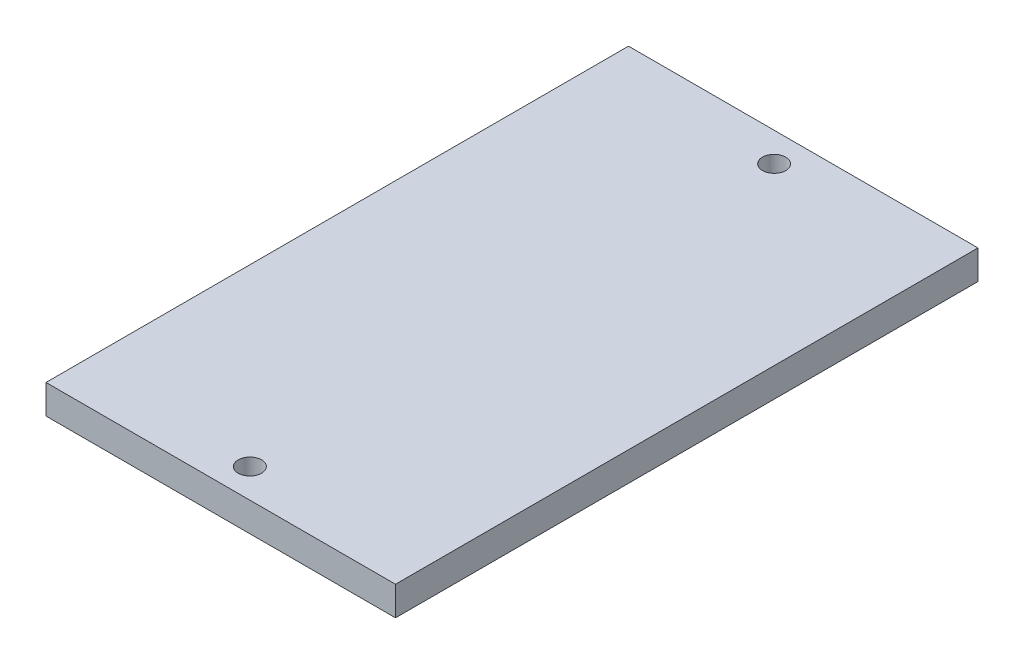
ISO-10303-21;
HEADER;
FILE_DESCRIPTION(('STEP AP214'),'2;1');
FILE_NAME('part.step','',(''),(''),'','','');
FILE_SCHEMA(('AUTOMOTIVE_DESIGN { 1 0 10303 214 1 1 1 1 }'));
ENDSEC;
DATA;
#1=APPLICATION_CONTEXT('core data for automotive mechanical design processes');
#2=APPLICATION_PROTOCOL_DEFINITION('international standard','automotive_design',2000,#1);
#3=PRODUCT_CONTEXT('',#1,'mechanical');
#4=PRODUCT('Part','Part','',(#3));
#5=PRODUCT_RELATED_PRODUCT_CATEGORY('part','',(#4));
#6=PRODUCT_DEFINITION_FORMATION('','',#4);
#7=PRODUCT_DEFINITION_CONTEXT('part definition',#1,'design');
#8=PRODUCT_DEFINITION('design','',#6,#7);
#9=PRODUCT_DEFINITION_SHAPE('','',#8);
#10=(LENGTH_UNIT() NAMED_UNIT(*) SI_UNIT(.MILLI.,.METRE.));
#11=(NAMED_UNIT(*) PLANE_ANGLE_UNIT() SI_UNIT($,.RADIAN.));
#12=(NAMED_UNIT(*) SI_UNIT($,.STERADIAN.) SOLID_ANGLE_UNIT());
#13=UNCERTAINTY_MEASURE_WITH_UNIT(LENGTH_MEASURE(1.E-05),#10,'distance_accuracy_value','');
#14=(GEOMETRIC_REPRESENTATION_CONTEXT(3) GLOBAL_UNCERTAINTY_ASSIGNED_CONTEXT((#13)) GLOBAL_UNIT_ASSIGNED_CONTEXT((#10,
#11,#12)) REPRESENTATION_CONTEXT('',''));
#15=CARTESIAN_POINT('',(0.,0.,0.));
#16=DIRECTION('',(0.,0.,1.));
#17=DIRECTION('',(1.,0.,0.));
#18=AXIS2_PLACEMENT_3D('',#15,#16,#17);
#19=CARTESIAN_POINT('',(36.2285196606894,6.35,63.5));
#20=DIRECTION('',(-1.,0.,0.));
#21=DIRECTION('',(0.,0.,1.));
#22=AXIS2_PLACEMENT_3D('',#19,#20,#21);
#23=PLANE('',#22);
#24=DIRECTION('',(0.,0.,-1.));
#25=VECTOR('',#24,1.);
#26=CARTESIAN_POINT('',(36.2285196606894,0.,63.5));
#27=LINE('',#26,#25);
#28=CARTESIAN_POINT('',(36.2285196606894,0.,63.5));
#29=VERTEX_POINT('',#28);
#30=CARTESIAN_POINT('',(36.2285196606894,0.,-63.5));
#31=VERTEX_POINT('',#30);
#32=EDGE_CURVE('E105',#29,#31,#27,.T.);
#33=ORIENTED_EDGE('',*,*,#32,.T.);
#34=DIRECTION('',(0.,-1.,0.));
#35=VECTOR('',#34,1.);
#36=CARTESIAN_POINT('',(36.2285196606894,6.35,-63.5));
#37=LINE('',#36,#35);
#38=CARTESIAN_POINT('',(36.2285196606894,6.35,-63.5));
#39=VERTEX_POINT('',#38);
#40=EDGE_CURVE('E11',#39,#31,#37,.T.);
#41=ORIENTED_EDGE('',*,*,#40,.F.);
#42=DIRECTION('',(0.,0.,-1.));
#43=VECTOR('',#42,1.);
#44=CARTESIAN_POINT('',(36.2285196606894,6.35,63.5));
#45=LINE('',#44,#43);
#46=CARTESIAN_POINT('',(36.2285196606894,6.35,63.5));
#47=VERTEX_POINT('',#46);
#48=EDGE_CURVE('E92',#47,#39,#45,.T.);
#49=ORIENTED_EDGE('',*,*,#48,.F.);
#50=DIRECTION('',(0.,-1.,0.));
#51=VECTOR('',#50,1.);
#52=CARTESIAN_POINT('',(36.2285196606894,6.35,63.5));
#53=LINE('',#52,#51);
#54=EDGE_CURVE('E101',#47,#29,#53,.T.);
#55=ORIENTED_EDGE('',*,*,#54,.T.);
#56=EDGE_LOOP('',(#33,#41,#49,#55));
#57=FACE_BOUND('',#56,.T.);
#58=ADVANCED_FACE('F39',(#57),#23,.F.);
#59=CARTESIAN_POINT('',(-39.9714803393106,6.35,-63.5));
#60=DIRECTION('',(0.,0.,1.));
#61=DIRECTION('',(1.,0.,0.));
#62=AXIS2_PLACEMENT_3D('',#59,#60,#61);
#63=PLANE('',#62);
#64=DIRECTION('',(-1.,0.,0.));
#65=VECTOR('',#64,1.);
#66=CARTESIAN_POINT('',(-39.9714803393106,0.,-63.5));
#67=LINE('',#66,#65);
#68=CARTESIAN_POINT('',(-39.9714803393106,0.,-63.5));
#69=VERTEX_POINT('',#68);
#70=EDGE_CURVE('E96',#31,#69,#67,.T.);
#71=ORIENTED_EDGE('',*,*,#70,.T.);
#72=DIRECTION('',(0.,-1.,0.));
#73=VECTOR('',#72,1.);
#74=CARTESIAN_POINT('',(-39.9714803393106,6.35,-63.5));
#75=LINE('',#74,#73);
#76=CARTESIAN_POINT('',(-39.9714803393106,6.35,-63.5));
#77=VERTEX_POINT('',#76);
#78=EDGE_CURVE('E48',#77,#69,#75,.T.);
#79=ORIENTED_EDGE('',*,*,#78,.F.);
#80=DIRECTION('',(-1.,0.,0.));
#81=VECTOR('',#80,1.);
#82=CARTESIAN_POINT('',(-39.9714803393106,6.35,-63.5));
#83=LINE('',#82,#81);
#84=EDGE_CURVE('E87',#39,#77,#83,.T.);
#85=ORIENTED_EDGE('',*,*,#84,.F.);
#86=ORIENTED_EDGE('',*,*,#40,.T.);
#87=EDGE_LOOP('',(#71,#79,#85,#86));
#88=FACE_BOUND('',#87,.T.);
#89=ADVANCED_FACE('F95',(#88),#63,.F.);
#90=CARTESIAN_POINT('',(-39.9714803393106,6.35,63.5));
#91=DIRECTION('',(1.,0.,0.));
#92=DIRECTION('',(0.,0.,-1.));
#93=AXIS2_PLACEMENT_3D('',#90,#91,#92);
#94=PLANE('',#93);
#95=DIRECTION('',(0.,0.,1.));
#96=VECTOR('',#95,1.);
#97=CARTESIAN_POINT('',(-39.9714803393106,0.,63.5));
#98=LINE('',#97,#96);
#99=CARTESIAN_POINT('',(-39.9714803393106,0.,63.5));
#100=VERTEX_POINT('',#99);
#101=EDGE_CURVE('E74',#69,#100,#98,.T.);
#102=ORIENTED_EDGE('',*,*,#101,.T.);
#103=DIRECTION('',(0.,-1.,0.));
#104=VECTOR('',#103,1.);
#105=CARTESIAN_POINT('',(-39.9714803393106,6.35,63.5));
#106=LINE('',#105,#104);
#107=CARTESIAN_POINT('',(-39.9714803393106,6.35,63.5));
#108=VERTEX_POINT('',#107);
#109=EDGE_CURVE('E97',#108,#100,#106,.T.);
#110=ORIENTED_EDGE('',*,*,#109,.F.);
#111=DIRECTION('',(0.,0.,1.));
#112=VECTOR('',#111,1.);
#113=CARTESIAN_POINT('',(-39.9714803393106,6.35,63.5));
#114=LINE('',#113,#112);
#115=EDGE_CURVE('E90',#77,#108,#114,.T.);
#116=ORIENTED_EDGE('',*,*,#115,.F.);
#117=ORIENTED_EDGE('',*,*,#78,.T.);
#118=EDGE_LOOP('',(#102,#110,#116,#117));
#119=FACE_BOUND('',#118,.T.);
#120=ADVANCED_FACE('F99',(#119),#94,.F.);
#121=CARTESIAN_POINT('',(-39.9714803393106,6.35,63.5));
#122=DIRECTION('',(0.,0.,-1.));
#123=DIRECTION('',(-1.,0.,0.));
#124=AXIS2_PLACEMENT_3D('',#121,#122,#123);
#125=PLANE('',#124);
#126=DIRECTION('',(1.,0.,0.));
#127=VECTOR('',#126,1.);
#128=CARTESIAN_POINT('',(-39.9714803393106,0.,63.5));
#129=LINE('',#128,#127);
#130=EDGE_CURVE('E80',#100,#29,#129,.T.);
#131=ORIENTED_EDGE('',*,*,#130,.T.);
#132=ORIENTED_EDGE('',*,*,#54,.F.);
#133=DIRECTION('',(1.,0.,0.));
#134=VECTOR('',#133,1.);
#135=CARTESIAN_POINT('',(-39.9714803393106,6.35,63.5));
#136=LINE('',#135,#134);
#137=EDGE_CURVE('E57',#108,#47,#136,.T.);
#138=ORIENTED_EDGE('',*,*,#137,.F.);
#139=ORIENTED_EDGE('',*,*,#109,.T.);
#140=EDGE_LOOP('',(#131,#132,#138,#139));
#141=FACE_BOUND('',#140,.T.);
#142=ADVANCED_FACE('F131',(#141),#125,.F.);
#143=CARTESIAN_POINT('',(0.,6.35,0.));
#144=DIRECTION('',(0.,-1.,0.));
#145=DIRECTION('',(0.,0.,-1.));
#146=AXIS2_PLACEMENT_3D('',#143,#144,#145);
#147=PLANE('',#146);
#148=CARTESIAN_POINT('',(-1.87148033931062,6.35,-57.15));
#149=DIRECTION('',(0.,1.,0.));
#150=DIRECTION('',(0.,0.,1.));
#151=AXIS2_PLACEMENT_3D('',#148,#149,#150);
#152=CIRCLE('',#151,2.53999999999999);
#153=CARTESIAN_POINT('',(-1.87148033931062,6.35,-54.61));
#154=VERTEX_POINT('',#153);
#155=EDGE_CURVE('E114',#154,#154,#152,.T.);
#156=ORIENTED_EDGE('',*,*,#155,.F.);
#157=EDGE_LOOP('',(#156));
#158=FACE_BOUND('',#157,.T.);
#159=CARTESIAN_POINT('',(-1.87148033931066,6.35,57.15));
#160=DIRECTION('',(0.,1.,0.));
#161=DIRECTION('',(0.,0.,1.));
#162=AXIS2_PLACEMENT_3D('',#159,#160,#161);
#163=CIRCLE('',#162,2.54);
#164=CARTESIAN_POINT('',(-1.87148033931066,6.35,59.69));
#165=VERTEX_POINT('',#164);
#166=EDGE_CURVE('E119',#165,#165,#163,.T.);
#167=ORIENTED_EDGE('',*,*,#166,.F.);
#168=EDGE_LOOP('',(#167));
#169=FACE_BOUND('',#168,.T.);
#170=ORIENTED_EDGE('',*,*,#48,.T.);
#171=ORIENTED_EDGE('',*,*,#84,.T.);
#172=ORIENTED_EDGE('',*,*,#115,.T.);
#173=ORIENTED_EDGE('',*,*,#137,.T.);
#174=EDGE_LOOP('',(#170,#171,#172,#173));
#175=FACE_BOUND('',#174,.T.);
#176=ADVANCED_FACE('F88',(#158,#169,#175),#147,.F.);
#177=CARTESIAN_POINT('',(0.,0.,0.));
#178=DIRECTION('',(0.,-1.,0.));
#179=DIRECTION('',(0.,0.,-1.));
#180=AXIS2_PLACEMENT_3D('',#177,#178,#179);
#181=PLANE('',#180);
#182=CARTESIAN_POINT('',(-1.87148033931062,0.,-57.15));
#183=DIRECTION('',(0.,-1.,0.));
#184=DIRECTION('',(0.,0.,-1.));
#185=AXIS2_PLACEMENT_3D('',#182,#183,#184);
#186=CIRCLE('',#185,2.53999999999999);
#187=CARTESIAN_POINT('',(-1.87148033931062,0.,-54.61));
#188=VERTEX_POINT('',#187);
#189=EDGE_CURVE('E42',#188,#188,#186,.T.);
#190=ORIENTED_EDGE('',*,*,#189,.F.);
#191=EDGE_LOOP('',(#190));
#192=FACE_BOUND('',#191,.T.);
#193=CARTESIAN_POINT('',(-1.87148033931066,0.,57.15));
#194=DIRECTION('',(0.,-1.,0.));
#195=DIRECTION('',(0.,0.,-1.));
#196=AXIS2_PLACEMENT_3D('',#193,#194,#195);
#197=CIRCLE('',#196,2.54);
#198=CARTESIAN_POINT('',(-1.87148033931066,0.,59.69));
#199=VERTEX_POINT('',#198);
#200=EDGE_CURVE('E112',#199,#199,#197,.T.);
#201=ORIENTED_EDGE('',*,*,#200,.F.);
#202=EDGE_LOOP('',(#201));
#203=FACE_BOUND('',#202,.T.);
#204=ORIENTED_EDGE('',*,*,#32,.F.);
#205=ORIENTED_EDGE('',*,*,#130,.F.);
#206=ORIENTED_EDGE('',*,*,#101,.F.);
#207=ORIENTED_EDGE('',*,*,#70,.F.);
#208=EDGE_LOOP('',(#204,#205,#206,#207));
#209=FACE_BOUND('',#208,.T.);
#210=ADVANCED_FACE('F130',(#192,#203,#209),#181,.T.);
#211=CARTESIAN_POINT('',(-1.87148033931066,-3.175,57.15));
#212=DIRECTION('',(0.,1.,0.));
#213=DIRECTION('',(0.,0.,1.));
#214=AXIS2_PLACEMENT_3D('',#211,#212,#213);
#215=CYLINDRICAL_SURFACE('',#214,2.54);
#216=CARTESIAN_POINT('',(-1.87148033931066,0.,59.69));
#217=CARTESIAN_POINT('',(-1.87148033931066,0.0661458333333336,59.69));
#218=CARTESIAN_POINT('',(-1.87148033931066,0.132291666666667,59.69));
#219=CARTESIAN_POINT('',(-1.87148033931066,0.264583333333334,59.69));
#220=CARTESIAN_POINT('',(-1.87148033931066,0.330729166666667,59.69));
#221=CARTESIAN_POINT('',(-1.87148033931066,0.463020833333334,59.69));
#222=CARTESIAN_POINT('',(-1.87148033931066,0.529166666666667,59.69));
#223=CARTESIAN_POINT('',(-1.87148033931066,0.661458333333334,59.69));
#224=CARTESIAN_POINT('',(-1.87148033931066,0.727604166666667,59.69));
#225=CARTESIAN_POINT('',(-1.87148033931066,0.859895833333333,59.69));
#226=CARTESIAN_POINT('',(-1.87148033931066,0.926041666666667,59.69));
#227=CARTESIAN_POINT('',(-1.87148033931066,1.05833333333333,59.69));
#228=CARTESIAN_POINT('',(-1.87148033931066,1.12447916666667,59.69));
#229=CARTESIAN_POINT('',(-1.87148033931066,1.25677083333333,59.69));
#230=CARTESIAN_POINT('',(-1.87148033931066,1.32291666666667,59.69));
#231=CARTESIAN_POINT('',(-1.87148033931066,1.45520833333333,59.69));
#232=CARTESIAN_POINT('',(-1.87148033931066,1.52135416666667,59.69));
#233=CARTESIAN_POINT('',(-1.87148033931066,1.65364583333333,59.69));
#234=CARTESIAN_POINT('',(-1.87148033931066,1.71979166666667,59.69));
#235=CARTESIAN_POINT('',(-1.87148033931066,1.85208333333333,59.69));
#236=CARTESIAN_POINT('',(-1.87148033931066,1.91822916666667,59.69));
#237=CARTESIAN_POINT('',(-1.87148033931066,2.05052083333333,59.69));
#238=CARTESIAN_POINT('',(-1.87148033931066,2.11666666666667,59.69));
#239=CARTESIAN_POINT('',(-1.87148033931066,2.24895833333333,59.69));
#240=CARTESIAN_POINT('',(-1.87148033931066,2.31510416666667,59.69));
#241=CARTESIAN_POINT('',(-1.87148033931066,2.44739583333333,59.69));
#242=CARTESIAN_POINT('',(-1.87148033931066,2.51354166666667,59.69));
#243=CARTESIAN_POINT('',(-1.87148033931066,2.64583333333333,59.69));
#244=CARTESIAN_POINT('',(-1.87148033931066,2.71197916666667,59.69));
#245=CARTESIAN_POINT('',(-1.87148033931066,2.84427083333333,59.69));
#246=CARTESIAN_POINT('',(-1.87148033931066,2.91041666666667,59.69));
#247=CARTESIAN_POINT('',(-1.87148033931066,3.04270833333333,59.69));
#248=CARTESIAN_POINT('',(-1.87148033931066,3.10885416666667,59.69));
#249=CARTESIAN_POINT('',(-1.87148033931066,3.24114583333333,59.69));
#250=CARTESIAN_POINT('',(-1.87148033931066,3.30729166666667,59.69));
#251=CARTESIAN_POINT('',(-1.87148033931066,3.43958333333333,59.69));
#252=CARTESIAN_POINT('',(-1.87148033931066,3.50572916666667,59.69));
#253=CARTESIAN_POINT('',(-1.87148033931066,3.63802083333333,59.69));
#254=CARTESIAN_POINT('',(-1.87148033931066,3.70416666666667,59.69));
#255=CARTESIAN_POINT('',(-1.87148033931066,3.83645833333333,59.69));
#256=CARTESIAN_POINT('',(-1.87148033931066,3.90260416666667,59.69));
#257=CARTESIAN_POINT('',(-1.87148033931066,4.03489583333333,59.69));
#258=CARTESIAN_POINT('',(-1.87148033931066,4.10104166666667,59.69));
#259=CARTESIAN_POINT('',(-1.87148033931066,4.23333333333333,59.69));
#260=CARTESIAN_POINT('',(-1.87148033931066,4.29947916666667,59.69));
#261=CARTESIAN_POINT('',(-1.87148033931066,4.43177083333333,59.69));
#262=CARTESIAN_POINT('',(-1.87148033931066,4.49791666666667,59.69));
#263=CARTESIAN_POINT('',(-1.87148033931066,4.63020833333333,59.69));
#264=CARTESIAN_POINT('',(-1.87148033931066,4.69635416666667,59.69));
#265=CARTESIAN_POINT('',(-1.87148033931066,4.82864583333333,59.69));
#266=CARTESIAN_POINT('',(-1.87148033931066,4.89479166666667,59.69));
#267=CARTESIAN_POINT('',(-1.87148033931066,5.02708333333333,59.69));
#268=CARTESIAN_POINT('',(-1.87148033931066,5.09322916666667,59.69));
#269=CARTESIAN_POINT('',(-1.87148033931066,5.22552083333333,59.69));
#270=CARTESIAN_POINT('',(-1.87148033931066,5.29166666666667,59.69));
#271=CARTESIAN_POINT('',(-1.87148033931066,5.42395833333333,59.69));
#272=CARTESIAN_POINT('',(-1.87148033931066,5.49010416666667,59.69));
#273=CARTESIAN_POINT('',(-1.87148033931066,5.62239583333333,59.69));
#274=CARTESIAN_POINT('',(-1.87148033931066,5.68854166666667,59.69));
#275=CARTESIAN_POINT('',(-1.87148033931066,5.82083333333333,59.69));
#276=CARTESIAN_POINT('',(-1.87148033931066,5.88697916666667,59.69));
#277=CARTESIAN_POINT('',(-1.87148033931066,6.01927083333333,59.69));
#278=CARTESIAN_POINT('',(-1.87148033931066,6.08541666666667,59.69));
#279=CARTESIAN_POINT('',(-1.87148033931066,6.21770833333333,59.69));
#280=CARTESIAN_POINT('',(-1.87148033931066,6.28385416666667,59.69));
#281=CARTESIAN_POINT('',(-1.87148033931066,6.35,59.69));
#282=B_SPLINE_CURVE_WITH_KNOTS('',3,(#216,#217,#218,#219,#220,#221,#222,#223,#224,#225,#226,
#227,#228,#229,#230,#231,#232,#233,#234,#235,#236,#237,#238,#239,#240,#241,#242,#243,#244,#245,
#246,#247,#248,#249,#250,#251,#252,#253,#254,#255,#256,#257,#258,#259,#260,#261,#262,#263,#264,
#265,#266,#267,#268,#269,#270,#271,#272,#273,#274,#275,#276,#277,#278,#279,#280,#281),
.UNSPECIFIED.,.F.,.F.,(4,2,2,2,2,2,2,2,2,2,2,2,2,2,2,2,2,2,2,2,2,2,2,2,2,2,2,2,2,2,2,2,4),(0.,
0.1984375,0.396875,0.5953125,0.79375,0.9921875,1.190625,1.3890625,1.5875,1.7859375,1.984375,
2.1828125,2.38125,2.5796875,2.778125,2.9765625,3.175,3.3734375,3.571875,3.7703125,3.96875,
4.1671875,4.365625,4.5640625,4.7625,4.9609375,5.159375,5.3578125,5.55625,5.7546875,5.953125,
6.1515625,6.35),.UNSPECIFIED.);
#283=EDGE_CURVE('BSEAM127',#199,#165,#282,.T.);
#284=ORIENTED_EDGE('',*,*,#200,.T.);
#285=ORIENTED_EDGE('',*,*,#166,.T.);
#286=ORIENTED_EDGE('',*,*,#283,.T.);
#287=ORIENTED_EDGE('',*,*,#283,.F.);
#288=EDGE_LOOP('',(#284,#286,#285,#287));
#289=FACE_BOUND('',#288,.T.);
#290=ADVANCED_FACE('F127',(#289),#215,.F.);
#291=CARTESIAN_POINT('',(-1.87148033931062,-3.175,-57.15));
#292=DIRECTION('',(0.,1.,0.));
#293=DIRECTION('',(0.,0.,1.));
#294=AXIS2_PLACEMENT_3D('',#291,#292,#293);
#295=CYLINDRICAL_SURFACE('',#294,2.53999999999999);
#296=CARTESIAN_POINT('',(-1.87148033931062,0.,-54.61));
#297=CARTESIAN_POINT('',(-1.87148033931062,0.0661458333333336,-54.61));
#298=CARTESIAN_POINT('',(-1.87148033931062,0.132291666666667,-54.61));
#299=CARTESIAN_POINT('',(-1.87148033931062,0.264583333333334,-54.61));
#300=CARTESIAN_POINT('',(-1.87148033931062,0.330729166666667,-54.61));
#301=CARTESIAN_POINT('',(-1.87148033931062,0.463020833333334,-54.61));
#302=CARTESIAN_POINT('',(-1.87148033931062,0.529166666666667,-54.61));
#303=CARTESIAN_POINT('',(-1.87148033931062,0.661458333333334,-54.61));
#304=CARTESIAN_POINT('',(-1.87148033931062,0.727604166666667,-54.61));
#305=CARTESIAN_POINT('',(-1.87148033931062,0.859895833333333,-54.61));
#306=CARTESIAN_POINT('',(-1.87148033931062,0.926041666666667,-54.61));
#307=CARTESIAN_POINT('',(-1.87148033931062,1.05833333333333,-54.61));
#308=CARTESIAN_POINT('',(-1.87148033931062,1.12447916666667,-54.61));
#309=CARTESIAN_POINT('',(-1.87148033931062,1.25677083333333,-54.61));
#310=CARTESIAN_POINT('',(-1.87148033931062,1.32291666666667,-54.61));
#311=CARTESIAN_POINT('',(-1.87148033931062,1.45520833333333,-54.61));
#312=CARTESIAN_POINT('',(-1.87148033931062,1.52135416666667,-54.61));
#313=CARTESIAN_POINT('',(-1.87148033931062,1.65364583333333,-54.61));
#314=CARTESIAN_POINT('',(-1.87148033931062,1.71979166666667,-54.61));
#315=CARTESIAN_POINT('',(-1.87148033931062,1.85208333333333,-54.61));
#316=CARTESIAN_POINT('',(-1.87148033931062,1.91822916666667,-54.61));
#317=CARTESIAN_POINT('',(-1.87148033931062,2.05052083333333,-54.61));
#318=CARTESIAN_POINT('',(-1.87148033931062,2.11666666666667,-54.61));
#319=CARTESIAN_POINT('',(-1.87148033931062,2.24895833333333,-54.61));
#320=CARTESIAN_POINT('',(-1.87148033931062,2.31510416666667,-54.61));
#321=CARTESIAN_POINT('',(-1.87148033931062,2.44739583333333,-54.61));
#322=CARTESIAN_POINT('',(-1.87148033931062,2.51354166666667,-54.61));
#323=CARTESIAN_POINT('',(-1.87148033931062,2.64583333333333,-54.61));
#324=CARTESIAN_POINT('',(-1.87148033931062,2.71197916666667,-54.61));
#325=CARTESIAN_POINT('',(-1.87148033931062,2.84427083333333,-54.61));
#326=CARTESIAN_POINT('',(-1.87148033931062,2.91041666666667,-54.61));
#327=CARTESIAN_POINT('',(-1.87148033931062,3.04270833333333,-54.61));
#328=CARTESIAN_POINT('',(-1.87148033931062,3.10885416666667,-54.61));
#329=CARTESIAN_POINT('',(-1.87148033931062,3.24114583333333,-54.61));
#330=CARTESIAN_POINT('',(-1.87148033931062,3.30729166666667,-54.61));
#331=CARTESIAN_POINT('',(-1.87148033931062,3.43958333333333,-54.61));
#332=CARTESIAN_POINT('',(-1.87148033931062,3.50572916666667,-54.61));
#333=CARTESIAN_POINT('',(-1.87148033931062,3.63802083333333,-54.61));
#334=CARTESIAN_POINT('',(-1.87148033931062,3.70416666666667,-54.61));
#335=CARTESIAN_POINT('',(-1.87148033931062,3.83645833333333,-54.61));
#336=CARTESIAN_POINT('',(-1.87148033931062,3.90260416666667,-54.61));
#337=CARTESIAN_POINT('',(-1.87148033931062,4.03489583333333,-54.61));
#338=CARTESIAN_POINT('',(-1.87148033931062,4.10104166666667,-54.61));
#339=CARTESIAN_POINT('',(-1.87148033931062,4.23333333333333,-54.61));
#340=CARTESIAN_POINT('',(-1.87148033931062,4.29947916666667,-54.61));
#341=CARTESIAN_POINT('',(-1.87148033931062,4.43177083333333,-54.61));
#342=CARTESIAN_POINT('',(-1.87148033931062,4.49791666666667,-54.61));
#343=CARTESIAN_POINT('',(-1.87148033931062,4.63020833333333,-54.61));
#344=CARTESIAN_POINT('',(-1.87148033931062,4.69635416666667,-54.61));
#345=CARTESIAN_POINT('',(-1.87148033931062,4.82864583333333,-54.61));
#346=CARTESIAN_POINT('',(-1.87148033931062,4.89479166666667,-54.61));
#347=CARTESIAN_POINT('',(-1.87148033931062,5.02708333333333,-54.61));
#348=CARTESIAN_POINT('',(-1.87148033931062,5.09322916666667,-54.61));
#349=CARTESIAN_POINT('',(-1.87148033931062,5.22552083333333,-54.61));
#350=CARTESIAN_POINT('',(-1.87148033931062,5.29166666666667,-54.61));
#351=CARTESIAN_POINT('',(-1.87148033931062,5.42395833333333,-54.61));
#352=CARTESIAN_POINT('',(-1.87148033931062,5.49010416666667,-54.61));
#353=CARTESIAN_POINT('',(-1.87148033931062,5.62239583333333,-54.61));
#354=CARTESIAN_POINT('',(-1.87148033931062,5.68854166666667,-54.61));
#355=CARTESIAN_POINT('',(-1.87148033931062,5.82083333333333,-54.61));
#356=CARTESIAN_POINT('',(-1.87148033931062,5.88697916666667,-54.61));
#357=CARTESIAN_POINT('',(-1.87148033931062,6.01927083333333,-54.61));
#358=CARTESIAN_POINT('',(-1.87148033931062,6.08541666666667,-54.61));
#359=CARTESIAN_POINT('',(-1.87148033931062,6.21770833333333,-54.61));
#360=CARTESIAN_POINT('',(-1.87148033931062,6.28385416666667,-54.61));
#361=CARTESIAN_POINT('',(-1.87148033931062,6.35,-54.61));
#362=B_SPLINE_CURVE_WITH_KNOTS('',3,(#296,#297,#298,#299,#300,#301,#302,#303,#304,#305,#306,
#307,#308,#309,#310,#311,#312,#313,#314,#315,#316,#317,#318,#319,#320,#321,#322,#323,#324,#325,
#326,#327,#328,#329,#330,#331,#332,#333,#334,#335,#336,#337,#338,#339,#340,#341,#342,#343,#344,
#345,#346,#347,#348,#349,#350,#351,#352,#353,#354,#355,#356,#357,#358,#359,#360,#361),
.UNSPECIFIED.,.F.,.F.,(4,2,2,2,2,2,2,2,2,2,2,2,2,2,2,2,2,2,2,2,2,2,2,2,2,2,2,2,2,2,2,2,4),(0.,
0.1984375,0.396875,0.5953125,0.79375,0.9921875,1.190625,1.3890625,1.5875,1.7859375,1.984375,
2.1828125,2.38125,2.5796875,2.778125,2.9765625,3.175,3.3734375,3.571875,3.7703125,3.96875,
4.1671875,4.365625,4.5640625,4.7625,4.9609375,5.159375,5.3578125,5.55625,5.7546875,5.953125,
6.1515625,6.35),.UNSPECIFIED.);
#363=EDGE_CURVE('BSEAM181',#188,#154,#362,.T.);
#364=ORIENTED_EDGE('',*,*,#189,.T.);
#365=ORIENTED_EDGE('',*,*,#155,.T.);
#366=ORIENTED_EDGE('',*,*,#363,.T.);
#367=ORIENTED_EDGE('',*,*,#363,.F.);
#368=EDGE_LOOP('',(#364,#366,#365,#367));
#369=FACE_BOUND('',#368,.T.);
#370=ADVANCED_FACE('F181',(#369),#295,.F.);
#371=CLOSED_SHELL('',(#58,#89,#120,#142,#176,#210,#290,#370));
#372=MANIFOLD_SOLID_BREP('B2',#371);
#373=ADVANCED_BREP_SHAPE_REPRESENTATION('',(#18,#372),#14);
#374=SHAPE_DEFINITION_REPRESENTATION(#9,#373);
ENDSEC;
END-ISO-10303-21;
